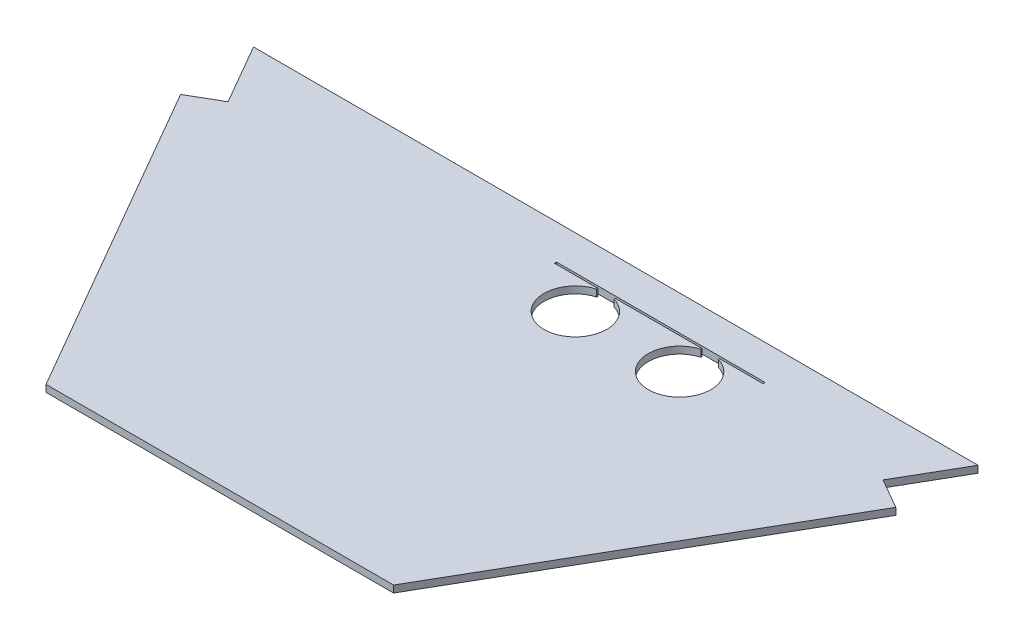
ISO-10303-21;
HEADER;
FILE_DESCRIPTION(('STEP AP214'),'2;1');
FILE_NAME('part.step','',(''),(''),'','','');
FILE_SCHEMA(('AUTOMOTIVE_DESIGN { 1 0 10303 214 1 1 1 1 }'));
ENDSEC;
DATA;
#1=APPLICATION_CONTEXT('core data for automotive mechanical design processes');
#2=APPLICATION_PROTOCOL_DEFINITION('international standard','automotive_design',2000,#1);
#3=PRODUCT_CONTEXT('',#1,'mechanical');
#4=PRODUCT('Part','Part','',(#3));
#5=PRODUCT_RELATED_PRODUCT_CATEGORY('part','',(#4));
#6=PRODUCT_DEFINITION_FORMATION('','',#4);
#7=PRODUCT_DEFINITION_CONTEXT('part definition',#1,'design');
#8=PRODUCT_DEFINITION('design','',#6,#7);
#9=PRODUCT_DEFINITION_SHAPE('','',#8);
#10=(LENGTH_UNIT() NAMED_UNIT(*) SI_UNIT(.MILLI.,.METRE.));
#11=(NAMED_UNIT(*) PLANE_ANGLE_UNIT() SI_UNIT($,.RADIAN.));
#12=(NAMED_UNIT(*) SI_UNIT($,.STERADIAN.) SOLID_ANGLE_UNIT());
#13=UNCERTAINTY_MEASURE_WITH_UNIT(LENGTH_MEASURE(1.E-05),#10,'distance_accuracy_value','');
#14=(GEOMETRIC_REPRESENTATION_CONTEXT(3) GLOBAL_UNCERTAINTY_ASSIGNED_CONTEXT((#13)) GLOBAL_UNIT_ASSIGNED_CONTEXT((#10,
#11,#12)) REPRESENTATION_CONTEXT('',''));
#15=CARTESIAN_POINT('',(0.,0.,0.));
#16=DIRECTION('',(0.,0.,1.));
#17=DIRECTION('',(1.,0.,0.));
#18=AXIS2_PLACEMENT_3D('',#15,#16,#17);
#19=CARTESIAN_POINT('',(0.,10.,0.));
#20=DIRECTION('',(0.86602540378444,0.,-0.499999999999998));
#21=DIRECTION('',(-0.499999999999998,0.,-0.86602540378444));
#22=AXIS2_PLACEMENT_3D('',#19,#20,#21);
#23=PLANE('',#22);
#24=DIRECTION('',(0.499999999999998,0.,0.86602540378444));
#25=VECTOR('',#24,1.);
#26=CARTESIAN_POINT('',(0.,0.,0.));
#27=LINE('',#26,#25);
#28=CARTESIAN_POINT('',(-264.434999999999,0.,-458.014855299477));
#29=VERTEX_POINT('',#28);
#30=CARTESIAN_POINT('',(0.,0.,0.));
#31=VERTEX_POINT('',#30);
#32=EDGE_CURVE('E250',#29,#31,#27,.T.);
#33=ORIENTED_EDGE('',*,*,#32,.T.);
#34=DIRECTION('',(0.,-1.,0.));
#35=VECTOR('',#34,1.);
#36=CARTESIAN_POINT('',(0.,10.,0.));
#37=LINE('',#36,#35);
#38=CARTESIAN_POINT('',(0.,10.,0.));
#39=VERTEX_POINT('',#38);
#40=EDGE_CURVE('E11',#39,#31,#37,.T.);
#41=ORIENTED_EDGE('',*,*,#40,.F.);
#42=DIRECTION('',(0.499999999999998,0.,0.86602540378444));
#43=VECTOR('',#42,1.);
#44=CARTESIAN_POINT('',(0.,10.,0.));
#45=LINE('',#44,#43);
#46=CARTESIAN_POINT('',(-264.434999999999,10.,-458.014855299477));
#47=VERTEX_POINT('',#46);
#48=EDGE_CURVE('E270',#47,#39,#45,.T.);
#49=ORIENTED_EDGE('',*,*,#48,.F.);
#50=DIRECTION('',(0.,-1.,0.));
#51=VECTOR('',#50,1.);
#52=CARTESIAN_POINT('',(-264.434999999999,10.,-458.014855299477));
#53=LINE('',#52,#51);
#54=EDGE_CURVE('E288',#47,#29,#53,.T.);
#55=ORIENTED_EDGE('',*,*,#54,.T.);
#56=EDGE_LOOP('',(#33,#41,#49,#55));
#57=FACE_BOUND('',#56,.T.);
#58=ADVANCED_FACE('F33',(#57),#23,.F.);
#59=CARTESIAN_POINT('',(500.,10.,0.));
#60=DIRECTION('',(0.,0.,-1.));
#61=DIRECTION('',(-1.,0.,0.));
#62=AXIS2_PLACEMENT_3D('',#59,#60,#61);
#63=PLANE('',#62);
#64=DIRECTION('',(1.,0.,0.));
#65=VECTOR('',#64,1.);
#66=CARTESIAN_POINT('',(500.,0.,0.));
#67=LINE('',#66,#65);
#68=CARTESIAN_POINT('',(500.,0.,0.));
#69=VERTEX_POINT('',#68);
#70=EDGE_CURVE('E291',#31,#69,#67,.T.);
#71=ORIENTED_EDGE('',*,*,#70,.T.);
#72=DIRECTION('',(0.,-1.,0.));
#73=VECTOR('',#72,1.);
#74=CARTESIAN_POINT('',(500.,10.,0.));
#75=LINE('',#74,#73);
#76=CARTESIAN_POINT('',(500.,10.,0.));
#77=VERTEX_POINT('',#76);
#78=EDGE_CURVE('E40',#77,#69,#75,.T.);
#79=ORIENTED_EDGE('',*,*,#78,.F.);
#80=DIRECTION('',(1.,0.,0.));
#81=VECTOR('',#80,1.);
#82=CARTESIAN_POINT('',(500.,10.,0.));
#83=LINE('',#82,#81);
#84=EDGE_CURVE('E273',#39,#77,#83,.T.);
#85=ORIENTED_EDGE('',*,*,#84,.F.);
#86=ORIENTED_EDGE('',*,*,#40,.T.);
#87=EDGE_LOOP('',(#71,#79,#85,#86));
#88=FACE_BOUND('',#87,.T.);
#89=ADVANCED_FACE('F346',(#88),#63,.F.);
#90=CARTESIAN_POINT('',(500.,10.,0.));
#91=DIRECTION('',(-0.866025403784437,0.,-0.500000000000004));
#92=DIRECTION('',(-0.500000000000004,0.,0.866025403784437));
#93=AXIS2_PLACEMENT_3D('',#90,#91,#92);
#94=PLANE('',#93);
#95=DIRECTION('',(0.500000000000004,0.,-0.866025403784436));
#96=VECTOR('',#95,1.);
#97=CARTESIAN_POINT('',(500.,0.,0.));
#98=LINE('',#97,#96);
#99=CARTESIAN_POINT('',(764.435000000002,0.,-458.014855299475));
#100=VERTEX_POINT('',#99);
#101=EDGE_CURVE('E293',#69,#100,#98,.T.);
#102=ORIENTED_EDGE('',*,*,#101,.T.);
#103=DIRECTION('',(0.,-1.,0.));
#104=VECTOR('',#103,1.);
#105=CARTESIAN_POINT('',(764.435000000002,10.,-458.014855299475));
#106=LINE('',#105,#104);
#107=CARTESIAN_POINT('',(764.435000000002,10.,-458.014855299475));
#108=VERTEX_POINT('',#107);
#109=EDGE_CURVE('E318',#108,#100,#106,.T.);
#110=ORIENTED_EDGE('',*,*,#109,.F.);
#111=DIRECTION('',(0.500000000000004,0.,-0.866025403784436));
#112=VECTOR('',#111,1.);
#113=CARTESIAN_POINT('',(500.,10.,0.));
#114=LINE('',#113,#112);
#115=EDGE_CURVE('E276',#77,#108,#114,.T.);
#116=ORIENTED_EDGE('',*,*,#115,.F.);
#117=ORIENTED_EDGE('',*,*,#78,.T.);
#118=EDGE_LOOP('',(#102,#110,#116,#117));
#119=FACE_BOUND('',#118,.T.);
#120=ADVANCED_FACE('F325',(#119),#94,.F.);
#121=CARTESIAN_POINT('',(764.435000000002,10.,-458.014855299475));
#122=DIRECTION('',(-0.500000000000006,0.,0.866025403784435));
#123=DIRECTION('',(0.866025403784435,0.,0.500000000000006));
#124=AXIS2_PLACEMENT_3D('',#121,#122,#123);
#125=PLANE('',#124);
#126=DIRECTION('',(-0.866025403784435,0.,-0.500000000000006));
#127=VECTOR('',#126,1.);
#128=CARTESIAN_POINT('',(764.435000000002,0.,-458.014855299475));
#129=LINE('',#128,#127);
#130=CARTESIAN_POINT('',(721.13372981078,0.,-483.014855299475));
#131=VERTEX_POINT('',#130);
#132=EDGE_CURVE('E295',#100,#131,#129,.T.);
#133=ORIENTED_EDGE('',*,*,#132,.T.);
#134=DIRECTION('',(0.,-1.,0.));
#135=VECTOR('',#134,1.);
#136=CARTESIAN_POINT('',(721.13372981078,10.,-483.014855299475));
#137=LINE('',#136,#135);
#138=CARTESIAN_POINT('',(721.13372981078,10.,-483.014855299475));
#139=VERTEX_POINT('',#138);
#140=EDGE_CURVE('E315',#139,#131,#137,.T.);
#141=ORIENTED_EDGE('',*,*,#140,.F.);
#142=DIRECTION('',(-0.866025403784435,0.,-0.500000000000006));
#143=VECTOR('',#142,1.);
#144=CARTESIAN_POINT('',(764.435000000002,10.,-458.014855299475));
#145=LINE('',#144,#143);
#146=EDGE_CURVE('E278',#108,#139,#145,.T.);
#147=ORIENTED_EDGE('',*,*,#146,.F.);
#148=ORIENTED_EDGE('',*,*,#109,.T.);
#149=EDGE_LOOP('',(#133,#141,#147,#148));
#150=FACE_BOUND('',#149,.T.);
#151=ADVANCED_FACE('F336',(#150),#125,.F.);
#152=CARTESIAN_POINT('',(721.13372981078,10.,-483.014855299475));
#153=DIRECTION('',(-0.866025403784437,0.,-0.500000000000003));
#154=DIRECTION('',(-0.500000000000003,0.,0.866025403784437));
#155=AXIS2_PLACEMENT_3D('',#152,#153,#154);
#156=PLANE('',#155);
#157=DIRECTION('',(0.500000000000003,0.,-0.866025403784437));
#158=VECTOR('',#157,1.);
#159=CARTESIAN_POINT('',(721.13372981078,0.,-483.014855299475));
#160=LINE('',#159,#158);
#161=CARTESIAN_POINT('',(771.13372981078,0.,-569.617395677919));
#162=VERTEX_POINT('',#161);
#163=EDGE_CURVE('E297',#131,#162,#160,.T.);
#164=ORIENTED_EDGE('',*,*,#163,.T.);
#165=DIRECTION('',(0.,-1.,0.));
#166=VECTOR('',#165,1.);
#167=CARTESIAN_POINT('',(771.13372981078,10.,-569.617395677919));
#168=LINE('',#167,#166);
#169=CARTESIAN_POINT('',(771.13372981078,10.,-569.617395677919));
#170=VERTEX_POINT('',#169);
#171=EDGE_CURVE('E312',#170,#162,#168,.T.);
#172=ORIENTED_EDGE('',*,*,#171,.F.);
#173=DIRECTION('',(0.500000000000003,0.,-0.866025403784437));
#174=VECTOR('',#173,1.);
#175=CARTESIAN_POINT('',(721.13372981078,10.,-483.014855299475));
#176=LINE('',#175,#174);
#177=EDGE_CURVE('E280',#139,#170,#176,.T.);
#178=ORIENTED_EDGE('',*,*,#177,.F.);
#179=ORIENTED_EDGE('',*,*,#140,.T.);
#180=EDGE_LOOP('',(#164,#172,#178,#179));
#181=FACE_BOUND('',#180,.T.);
#182=ADVANCED_FACE('F340',(#181),#156,.F.);
#183=CARTESIAN_POINT('',(-271.133729810777,10.,-569.617395677921));
#184=DIRECTION('',(0.,0.,1.));
#185=DIRECTION('',(1.,0.,0.));
#186=AXIS2_PLACEMENT_3D('',#183,#184,#185);
#187=PLANE('',#186);
#188=DIRECTION('',(-1.,0.,0.));
#189=VECTOR('',#188,1.);
#190=CARTESIAN_POINT('',(-271.133729810777,0.,-569.617395677921));
#191=LINE('',#190,#189);
#192=CARTESIAN_POINT('',(-271.133729810777,0.,-569.617395677921));
#193=VERTEX_POINT('',#192);
#194=EDGE_CURVE('E299',#162,#193,#191,.T.);
#195=ORIENTED_EDGE('',*,*,#194,.T.);
#196=DIRECTION('',(0.,-1.,0.));
#197=VECTOR('',#196,1.);
#198=CARTESIAN_POINT('',(-271.133729810777,10.,-569.617395677921));
#199=LINE('',#198,#197);
#200=CARTESIAN_POINT('',(-271.133729810777,10.,-569.617395677921));
#201=VERTEX_POINT('',#200);
#202=EDGE_CURVE('E309',#201,#193,#199,.T.);
#203=ORIENTED_EDGE('',*,*,#202,.F.);
#204=DIRECTION('',(-1.,0.,0.));
#205=VECTOR('',#204,1.);
#206=CARTESIAN_POINT('',(-271.133729810777,10.,-569.617395677921));
#207=LINE('',#206,#205);
#208=EDGE_CURVE('E282',#170,#201,#207,.T.);
#209=ORIENTED_EDGE('',*,*,#208,.F.);
#210=ORIENTED_EDGE('',*,*,#171,.T.);
#211=EDGE_LOOP('',(#195,#203,#209,#210));
#212=FACE_BOUND('',#211,.T.);
#213=ADVANCED_FACE('F359',(#212),#187,.F.);
#214=CARTESIAN_POINT('',(-221.133729810777,10.,-483.014855299476));
#215=DIRECTION('',(0.86602540378444,0.,-0.499999999999998));
#216=DIRECTION('',(-0.499999999999998,0.,-0.86602540378444));
#217=AXIS2_PLACEMENT_3D('',#214,#215,#216);
#218=PLANE('',#217);
#219=DIRECTION('',(0.499999999999998,0.,0.86602540378444));
#220=VECTOR('',#219,1.);
#221=CARTESIAN_POINT('',(-221.133729810777,0.,-483.014855299476));
#222=LINE('',#221,#220);
#223=CARTESIAN_POINT('',(-221.133729810777,0.,-483.014855299476));
#224=VERTEX_POINT('',#223);
#225=EDGE_CURVE('E301',#193,#224,#222,.T.);
#226=ORIENTED_EDGE('',*,*,#225,.T.);
#227=DIRECTION('',(0.,-1.,0.));
#228=VECTOR('',#227,1.);
#229=CARTESIAN_POINT('',(-221.133729810777,10.,-483.014855299476));
#230=LINE('',#229,#228);
#231=CARTESIAN_POINT('',(-221.133729810777,10.,-483.014855299476));
#232=VERTEX_POINT('',#231);
#233=EDGE_CURVE('E306',#232,#224,#230,.T.);
#234=ORIENTED_EDGE('',*,*,#233,.F.);
#235=DIRECTION('',(0.499999999999998,0.,0.86602540378444));
#236=VECTOR('',#235,1.);
#237=CARTESIAN_POINT('',(-221.133729810777,10.,-483.014855299476));
#238=LINE('',#237,#236);
#239=EDGE_CURVE('E284',#201,#232,#238,.T.);
#240=ORIENTED_EDGE('',*,*,#239,.F.);
#241=ORIENTED_EDGE('',*,*,#202,.T.);
#242=EDGE_LOOP('',(#226,#234,#240,#241));
#243=FACE_BOUND('',#242,.T.);
#244=ADVANCED_FACE('F357',(#243),#218,.F.);
#245=CARTESIAN_POINT('',(-264.434999999999,10.,-458.014855299477));
#246=DIRECTION('',(0.499999999999998,0.,0.86602540378444));
#247=DIRECTION('',(0.86602540378444,0.,-0.499999999999998));
#248=AXIS2_PLACEMENT_3D('',#245,#246,#247);
#249=PLANE('',#248);
#250=DIRECTION('',(-0.86602540378444,0.,0.499999999999998));
#251=VECTOR('',#250,1.);
#252=CARTESIAN_POINT('',(-264.434999999999,0.,-458.014855299477));
#253=LINE('',#252,#251);
#254=EDGE_CURVE('E274',#224,#29,#253,.T.);
#255=ORIENTED_EDGE('',*,*,#254,.T.);
#256=ORIENTED_EDGE('',*,*,#54,.F.);
#257=DIRECTION('',(-0.86602540378444,0.,0.499999999999998));
#258=VECTOR('',#257,1.);
#259=CARTESIAN_POINT('',(-264.434999999999,10.,-458.014855299477));
#260=LINE('',#259,#258);
#261=EDGE_CURVE('E286',#232,#47,#260,.T.);
#262=ORIENTED_EDGE('',*,*,#261,.F.);
#263=ORIENTED_EDGE('',*,*,#233,.T.);
#264=EDGE_LOOP('',(#255,#256,#262,#263));
#265=FACE_BOUND('',#264,.T.);
#266=ADVANCED_FACE('F352',(#265),#249,.F.);
#267=CARTESIAN_POINT('',(0.,10.,0.));
#268=DIRECTION('',(0.,-1.,0.));
#269=DIRECTION('',(0.,0.,-1.));
#270=AXIS2_PLACEMENT_3D('',#267,#268,#269);
#271=PLANE('',#270);
#272=DIRECTION('',(-1.,0.,0.));
#273=VECTOR('',#272,1.);
#274=CARTESIAN_POINT('',(514.88372981078,10.,-516.62));
#275=LINE('',#274,#273);
#276=CARTESIAN_POINT('',(514.88372981078,10.,-516.62));
#277=VERTEX_POINT('',#276);
#278=CARTESIAN_POINT('',(452.38,10.,-516.62));
#279=VERTEX_POINT('',#278);
#280=EDGE_CURVE('E177',#277,#279,#275,.T.);
#281=ORIENTED_EDGE('',*,*,#280,.T.);
#282=DIRECTION('',(0.,0.,1.));
#283=VECTOR('',#282,1.);
#284=CARTESIAN_POINT('',(452.38,10.,-516.62));
#285=LINE('',#284,#283);
#286=CARTESIAN_POINT('',(452.38,10.,-514.849041164477));
#287=VERTEX_POINT('',#286);
#288=EDGE_CURVE('E171',#279,#287,#285,.T.);
#289=ORIENTED_EDGE('',*,*,#288,.T.);
#290=CARTESIAN_POINT('',(439.88,10.,-471.62));
#291=DIRECTION('',(0.,-1.,0.));
#292=DIRECTION('',(0.,0.,-1.));
#293=AXIS2_PLACEMENT_3D('',#290,#291,#292);
#294=CIRCLE('',#293,45.0000000000002);
#295=CARTESIAN_POINT('',(427.38,10.,-514.849041164477));
#296=VERTEX_POINT('',#295);
#297=EDGE_CURVE('E180',#287,#296,#294,.T.);
#298=ORIENTED_EDGE('',*,*,#297,.T.);
#299=DIRECTION('',(0.,0.,-1.));
#300=VECTOR('',#299,1.);
#301=CARTESIAN_POINT('',(427.38,10.,-516.62));
#302=LINE('',#301,#300);
#303=CARTESIAN_POINT('',(427.38,10.,-516.62));
#304=VERTEX_POINT('',#303);
#305=EDGE_CURVE('E47',#296,#304,#302,.T.);
#306=ORIENTED_EDGE('',*,*,#305,.T.);
#307=DIRECTION('',(-1.,0.,0.));
#308=VECTOR('',#307,1.);
#309=CARTESIAN_POINT('',(427.38,10.,-516.62));
#310=LINE('',#309,#308);
#311=CARTESIAN_POINT('',(302.38,10.,-516.62));
#312=VERTEX_POINT('',#311);
#313=EDGE_CURVE('E195',#304,#312,#310,.T.);
#314=ORIENTED_EDGE('',*,*,#313,.T.);
#315=DIRECTION('',(0.,0.,1.));
#316=VECTOR('',#315,1.);
#317=CARTESIAN_POINT('',(302.38,10.,-516.62));
#318=LINE('',#317,#316);
#319=CARTESIAN_POINT('',(302.38,10.,-514.849041164476));
#320=VERTEX_POINT('',#319);
#321=EDGE_CURVE('E198',#312,#320,#318,.T.);
#322=ORIENTED_EDGE('',*,*,#321,.T.);
#323=CARTESIAN_POINT('',(289.88,10.,-471.62));
#324=DIRECTION('',(0.,-1.,0.));
#325=DIRECTION('',(0.,0.,-1.));
#326=AXIS2_PLACEMENT_3D('',#323,#324,#325);
#327=CIRCLE('',#326,45.);
#328=CARTESIAN_POINT('',(277.38,10.,-514.849041164476));
#329=VERTEX_POINT('',#328);
#330=EDGE_CURVE('E201',#320,#329,#327,.T.);
#331=ORIENTED_EDGE('',*,*,#330,.T.);
#332=DIRECTION('',(0.,0.,-1.));
#333=VECTOR('',#332,1.);
#334=CARTESIAN_POINT('',(277.38,10.,-514.849041164476));
#335=LINE('',#334,#333);
#336=CARTESIAN_POINT('',(277.38,10.,-516.62));
#337=VERTEX_POINT('',#336);
#338=EDGE_CURVE('E204',#329,#337,#335,.T.);
#339=ORIENTED_EDGE('',*,*,#338,.T.);
#340=DIRECTION('',(-1.,0.,0.));
#341=VECTOR('',#340,1.);
#342=CARTESIAN_POINT('',(277.38,10.,-516.62));
#343=LINE('',#342,#341);
#344=CARTESIAN_POINT('',(214.88372981078,10.,-516.62));
#345=VERTEX_POINT('',#344);
#346=EDGE_CURVE('E207',#337,#345,#343,.T.);
#347=ORIENTED_EDGE('',*,*,#346,.T.);
#348=DIRECTION('',(0.,0.,-1.));
#349=VECTOR('',#348,1.);
#350=CARTESIAN_POINT('',(214.88372981078,10.,-516.62));
#351=LINE('',#350,#349);
#352=CARTESIAN_POINT('',(214.88372981078,10.,-519.62));
#353=VERTEX_POINT('',#352);
#354=EDGE_CURVE('E210',#345,#353,#351,.T.);
#355=ORIENTED_EDGE('',*,*,#354,.T.);
#356=DIRECTION('',(1.,0.,0.));
#357=VECTOR('',#356,1.);
#358=CARTESIAN_POINT('',(214.88372981078,10.,-519.62));
#359=LINE('',#358,#357);
#360=CARTESIAN_POINT('',(514.88372981078,10.,-519.62));
#361=VERTEX_POINT('',#360);
#362=EDGE_CURVE('E213',#353,#361,#359,.T.);
#363=ORIENTED_EDGE('',*,*,#362,.T.);
#364=DIRECTION('',(0.,0.,1.));
#365=VECTOR('',#364,1.);
#366=CARTESIAN_POINT('',(514.88372981078,10.,-519.62));
#367=LINE('',#366,#365);
#368=EDGE_CURVE('E216',#361,#277,#367,.T.);
#369=ORIENTED_EDGE('',*,*,#368,.T.);
#370=EDGE_LOOP('',(#281,#289,#298,#306,#314,#322,#331,#339,#347,#355,#363,#369));
#371=FACE_BOUND('',#370,.T.);
#372=ORIENTED_EDGE('',*,*,#48,.T.);
#373=ORIENTED_EDGE('',*,*,#84,.T.);
#374=ORIENTED_EDGE('',*,*,#115,.T.);
#375=ORIENTED_EDGE('',*,*,#146,.T.);
#376=ORIENTED_EDGE('',*,*,#177,.T.);
#377=ORIENTED_EDGE('',*,*,#208,.T.);
#378=ORIENTED_EDGE('',*,*,#239,.T.);
#379=ORIENTED_EDGE('',*,*,#261,.T.);
#380=EDGE_LOOP('',(#372,#373,#374,#375,#376,#377,#378,#379));
#381=FACE_BOUND('',#380,.T.);
#382=ADVANCED_FACE('F184',(#371,#381),#271,.F.);
#383=CARTESIAN_POINT('',(0.,0.,0.));
#384=DIRECTION('',(0.,-1.,0.));
#385=DIRECTION('',(0.,0.,-1.));
#386=AXIS2_PLACEMENT_3D('',#383,#384,#385);
#387=PLANE('',#386);
#388=DIRECTION('',(0.,0.,1.));
#389=VECTOR('',#388,1.);
#390=CARTESIAN_POINT('',(452.38,0.,-516.62));
#391=LINE('',#390,#389);
#392=CARTESIAN_POINT('',(452.38,0.,-516.62));
#393=VERTEX_POINT('',#392);
#394=CARTESIAN_POINT('',(452.38,0.,-514.849041164477));
#395=VERTEX_POINT('',#394);
#396=EDGE_CURVE('E55',#393,#395,#391,.T.);
#397=ORIENTED_EDGE('',*,*,#396,.F.);
#398=DIRECTION('',(-1.,0.,0.));
#399=VECTOR('',#398,1.);
#400=CARTESIAN_POINT('',(514.88372981078,0.,-516.62));
#401=LINE('',#400,#399);
#402=CARTESIAN_POINT('',(514.88372981078,0.,-516.62));
#403=VERTEX_POINT('',#402);
#404=EDGE_CURVE('E188',#403,#393,#401,.T.);
#405=ORIENTED_EDGE('',*,*,#404,.F.);
#406=DIRECTION('',(0.,0.,1.));
#407=VECTOR('',#406,1.);
#408=CARTESIAN_POINT('',(514.88372981078,0.,-519.62));
#409=LINE('',#408,#407);
#410=CARTESIAN_POINT('',(514.88372981078,0.,-519.62));
#411=VERTEX_POINT('',#410);
#412=EDGE_CURVE('E191',#411,#403,#409,.T.);
#413=ORIENTED_EDGE('',*,*,#412,.F.);
#414=DIRECTION('',(1.,0.,0.));
#415=VECTOR('',#414,1.);
#416=CARTESIAN_POINT('',(214.88372981078,0.,-519.62));
#417=LINE('',#416,#415);
#418=CARTESIAN_POINT('',(214.88372981078,0.,-519.62));
#419=VERTEX_POINT('',#418);
#420=EDGE_CURVE('E243',#419,#411,#417,.T.);
#421=ORIENTED_EDGE('',*,*,#420,.F.);
#422=DIRECTION('',(0.,0.,-1.));
#423=VECTOR('',#422,1.);
#424=CARTESIAN_POINT('',(214.88372981078,0.,-516.62));
#425=LINE('',#424,#423);
#426=CARTESIAN_POINT('',(214.88372981078,0.,-516.62));
#427=VERTEX_POINT('',#426);
#428=EDGE_CURVE('E240',#427,#419,#425,.T.);
#429=ORIENTED_EDGE('',*,*,#428,.F.);
#430=DIRECTION('',(-1.,0.,0.));
#431=VECTOR('',#430,1.);
#432=CARTESIAN_POINT('',(277.38,0.,-516.62));
#433=LINE('',#432,#431);
#434=CARTESIAN_POINT('',(277.38,0.,-516.62));
#435=VERTEX_POINT('',#434);
#436=EDGE_CURVE('E237',#435,#427,#433,.T.);
#437=ORIENTED_EDGE('',*,*,#436,.F.);
#438=DIRECTION('',(0.,0.,-1.));
#439=VECTOR('',#438,1.);
#440=CARTESIAN_POINT('',(277.38,0.,-514.849041164476));
#441=LINE('',#440,#439);
#442=CARTESIAN_POINT('',(277.38,0.,-514.849041164476));
#443=VERTEX_POINT('',#442);
#444=EDGE_CURVE('E234',#443,#435,#441,.T.);
#445=ORIENTED_EDGE('',*,*,#444,.F.);
#446=CARTESIAN_POINT('',(289.88,0.,-471.62));
#447=DIRECTION('',(0.,-1.,0.));
#448=DIRECTION('',(0.,0.,-1.));
#449=AXIS2_PLACEMENT_3D('',#446,#447,#448);
#450=CIRCLE('',#449,45.);
#451=CARTESIAN_POINT('',(302.38,0.,-514.849041164476));
#452=VERTEX_POINT('',#451);
#453=EDGE_CURVE('E231',#452,#443,#450,.T.);
#454=ORIENTED_EDGE('',*,*,#453,.F.);
#455=DIRECTION('',(0.,0.,1.));
#456=VECTOR('',#455,1.);
#457=CARTESIAN_POINT('',(302.38,0.,-516.62));
#458=LINE('',#457,#456);
#459=CARTESIAN_POINT('',(302.38,0.,-516.62));
#460=VERTEX_POINT('',#459);
#461=EDGE_CURVE('E228',#460,#452,#458,.T.);
#462=ORIENTED_EDGE('',*,*,#461,.F.);
#463=DIRECTION('',(-1.,0.,0.));
#464=VECTOR('',#463,1.);
#465=CARTESIAN_POINT('',(427.38,0.,-516.62));
#466=LINE('',#465,#464);
#467=CARTESIAN_POINT('',(427.38,0.,-516.62));
#468=VERTEX_POINT('',#467);
#469=EDGE_CURVE('E225',#468,#460,#466,.T.);
#470=ORIENTED_EDGE('',*,*,#469,.F.);
#471=DIRECTION('',(0.,0.,-1.));
#472=VECTOR('',#471,1.);
#473=CARTESIAN_POINT('',(427.38,0.,-516.62));
#474=LINE('',#473,#472);
#475=CARTESIAN_POINT('',(427.38,0.,-514.849041164477));
#476=VERTEX_POINT('',#475);
#477=EDGE_CURVE('E222',#476,#468,#474,.T.);
#478=ORIENTED_EDGE('',*,*,#477,.F.);
#479=CARTESIAN_POINT('',(439.88,0.,-471.62));
#480=DIRECTION('',(0.,-1.,0.));
#481=DIRECTION('',(0.,0.,-1.));
#482=AXIS2_PLACEMENT_3D('',#479,#480,#481);
#483=CIRCLE('',#482,45.0000000000002);
#484=EDGE_CURVE('E220',#395,#476,#483,.T.);
#485=ORIENTED_EDGE('',*,*,#484,.F.);
#486=EDGE_LOOP('',(#397,#405,#413,#421,#429,#437,#445,#454,#462,#470,#478,#485));
#487=FACE_BOUND('',#486,.T.);
#488=ORIENTED_EDGE('',*,*,#32,.F.);
#489=ORIENTED_EDGE('',*,*,#254,.F.);
#490=ORIENTED_EDGE('',*,*,#225,.F.);
#491=ORIENTED_EDGE('',*,*,#194,.F.);
#492=ORIENTED_EDGE('',*,*,#163,.F.);
#493=ORIENTED_EDGE('',*,*,#132,.F.);
#494=ORIENTED_EDGE('',*,*,#101,.F.);
#495=ORIENTED_EDGE('',*,*,#70,.F.);
#496=EDGE_LOOP('',(#488,#489,#490,#491,#492,#493,#494,#495));
#497=FACE_BOUND('',#496,.T.);
#498=ADVANCED_FACE('F331',(#487,#497),#387,.T.);
#499=CARTESIAN_POINT('',(452.38,10.,-516.62));
#500=DIRECTION('',(1.,0.,0.));
#501=DIRECTION('',(0.,0.,-1.));
#502=AXIS2_PLACEMENT_3D('',#499,#500,#501);
#503=PLANE('',#502);
#504=ORIENTED_EDGE('',*,*,#396,.T.);
#505=DIRECTION('',(0.,-1.,0.));
#506=VECTOR('',#505,1.);
#507=CARTESIAN_POINT('',(452.38,10.,-514.849041164477));
#508=LINE('',#507,#506);
#509=EDGE_CURVE('E167',#287,#395,#508,.T.);
#510=ORIENTED_EDGE('',*,*,#509,.F.);
#511=ORIENTED_EDGE('',*,*,#288,.F.);
#512=DIRECTION('',(0.,-1.,0.));
#513=VECTOR('',#512,1.);
#514=CARTESIAN_POINT('',(452.38,10.,-516.62));
#515=LINE('',#514,#513);
#516=EDGE_CURVE('E248',#279,#393,#515,.T.);
#517=ORIENTED_EDGE('',*,*,#516,.T.);
#518=EDGE_LOOP('',(#504,#510,#511,#517));
#519=FACE_BOUND('',#518,.T.);
#520=ADVANCED_FACE('F169',(#519),#503,.F.);
#521=CARTESIAN_POINT('',(514.88372981078,10.,-516.62));
#522=DIRECTION('',(0.,0.,1.));
#523=DIRECTION('',(1.,0.,0.));
#524=AXIS2_PLACEMENT_3D('',#521,#522,#523);
#525=PLANE('',#524);
#526=ORIENTED_EDGE('',*,*,#404,.T.);
#527=ORIENTED_EDGE('',*,*,#516,.F.);
#528=ORIENTED_EDGE('',*,*,#280,.F.);
#529=DIRECTION('',(0.,-1.,0.));
#530=VECTOR('',#529,1.);
#531=CARTESIAN_POINT('',(514.88372981078,10.,-516.62));
#532=LINE('',#531,#530);
#533=EDGE_CURVE('E251',#277,#403,#532,.T.);
#534=ORIENTED_EDGE('',*,*,#533,.T.);
#535=EDGE_LOOP('',(#526,#527,#528,#534));
#536=FACE_BOUND('',#535,.T.);
#537=ADVANCED_FACE('F426',(#536),#525,.F.);
#538=CARTESIAN_POINT('',(514.88372981078,10.,-519.62));
#539=DIRECTION('',(1.,0.,0.));
#540=DIRECTION('',(0.,0.,-1.));
#541=AXIS2_PLACEMENT_3D('',#538,#539,#540);
#542=PLANE('',#541);
#543=ORIENTED_EDGE('',*,*,#412,.T.);
#544=ORIENTED_EDGE('',*,*,#533,.F.);
#545=ORIENTED_EDGE('',*,*,#368,.F.);
#546=DIRECTION('',(0.,-1.,0.));
#547=VECTOR('',#546,1.);
#548=CARTESIAN_POINT('',(514.88372981078,10.,-519.62));
#549=LINE('',#548,#547);
#550=EDGE_CURVE('E253',#361,#411,#549,.T.);
#551=ORIENTED_EDGE('',*,*,#550,.T.);
#552=EDGE_LOOP('',(#543,#544,#545,#551));
#553=FACE_BOUND('',#552,.T.);
#554=ADVANCED_FACE('F435',(#553),#542,.F.);
#555=CARTESIAN_POINT('',(214.88372981078,10.,-519.62));
#556=DIRECTION('',(0.,0.,-1.));
#557=DIRECTION('',(-1.,0.,0.));
#558=AXIS2_PLACEMENT_3D('',#555,#556,#557);
#559=PLANE('',#558);
#560=ORIENTED_EDGE('',*,*,#420,.T.);
#561=ORIENTED_EDGE('',*,*,#550,.F.);
#562=ORIENTED_EDGE('',*,*,#362,.F.);
#563=DIRECTION('',(0.,-1.,0.));
#564=VECTOR('',#563,1.);
#565=CARTESIAN_POINT('',(214.88372981078,10.,-519.62));
#566=LINE('',#565,#564);
#567=EDGE_CURVE('E255',#353,#419,#566,.T.);
#568=ORIENTED_EDGE('',*,*,#567,.T.);
#569=EDGE_LOOP('',(#560,#561,#562,#568));
#570=FACE_BOUND('',#569,.T.);
#571=ADVANCED_FACE('F445',(#570),#559,.F.);
#572=CARTESIAN_POINT('',(214.88372981078,10.,-516.62));
#573=DIRECTION('',(-1.,0.,0.));
#574=DIRECTION('',(0.,0.,1.));
#575=AXIS2_PLACEMENT_3D('',#572,#573,#574);
#576=PLANE('',#575);
#577=ORIENTED_EDGE('',*,*,#428,.T.);
#578=ORIENTED_EDGE('',*,*,#567,.F.);
#579=ORIENTED_EDGE('',*,*,#354,.F.);
#580=DIRECTION('',(0.,-1.,0.));
#581=VECTOR('',#580,1.);
#582=CARTESIAN_POINT('',(214.88372981078,10.,-516.62));
#583=LINE('',#582,#581);
#584=EDGE_CURVE('E257',#345,#427,#583,.T.);
#585=ORIENTED_EDGE('',*,*,#584,.T.);
#586=EDGE_LOOP('',(#577,#578,#579,#585));
#587=FACE_BOUND('',#586,.T.);
#588=ADVANCED_FACE('F455',(#587),#576,.F.);
#589=CARTESIAN_POINT('',(277.38,10.,-516.62));
#590=DIRECTION('',(0.,0.,1.));
#591=DIRECTION('',(1.,0.,0.));
#592=AXIS2_PLACEMENT_3D('',#589,#590,#591);
#593=PLANE('',#592);
#594=ORIENTED_EDGE('',*,*,#436,.T.);
#595=ORIENTED_EDGE('',*,*,#584,.F.);
#596=ORIENTED_EDGE('',*,*,#346,.F.);
#597=DIRECTION('',(0.,-1.,0.));
#598=VECTOR('',#597,1.);
#599=CARTESIAN_POINT('',(277.38,10.,-516.62));
#600=LINE('',#599,#598);
#601=EDGE_CURVE('E259',#337,#435,#600,.T.);
#602=ORIENTED_EDGE('',*,*,#601,.T.);
#603=EDGE_LOOP('',(#594,#595,#596,#602));
#604=FACE_BOUND('',#603,.T.);
#605=ADVANCED_FACE('F465',(#604),#593,.F.);
#606=CARTESIAN_POINT('',(277.38,10.,-514.849041164476));
#607=DIRECTION('',(-1.,0.,0.));
#608=DIRECTION('',(0.,0.,1.));
#609=AXIS2_PLACEMENT_3D('',#606,#607,#608);
#610=PLANE('',#609);
#611=ORIENTED_EDGE('',*,*,#444,.T.);
#612=ORIENTED_EDGE('',*,*,#601,.F.);
#613=ORIENTED_EDGE('',*,*,#338,.F.);
#614=DIRECTION('',(0.,-1.,0.));
#615=VECTOR('',#614,1.);
#616=CARTESIAN_POINT('',(277.38,10.,-514.849041164476));
#617=LINE('',#616,#615);
#618=EDGE_CURVE('E261',#329,#443,#617,.T.);
#619=ORIENTED_EDGE('',*,*,#618,.T.);
#620=EDGE_LOOP('',(#611,#612,#613,#619));
#621=FACE_BOUND('',#620,.T.);
#622=ADVANCED_FACE('F475',(#621),#610,.F.);
#623=CARTESIAN_POINT('',(289.88,10.,-471.62));
#624=DIRECTION('',(0.,-1.,0.));
#625=DIRECTION('',(0.,0.,-1.));
#626=AXIS2_PLACEMENT_3D('',#623,#624,#625);
#627=CYLINDRICAL_SURFACE('',#626,45.);
#628=ORIENTED_EDGE('',*,*,#453,.T.);
#629=ORIENTED_EDGE('',*,*,#618,.F.);
#630=ORIENTED_EDGE('',*,*,#330,.F.);
#631=DIRECTION('',(0.,-1.,0.));
#632=VECTOR('',#631,1.);
#633=CARTESIAN_POINT('',(302.38,10.,-514.849041164476));
#634=LINE('',#633,#632);
#635=EDGE_CURVE('E263',#320,#452,#634,.T.);
#636=ORIENTED_EDGE('',*,*,#635,.T.);
#637=EDGE_LOOP('',(#628,#629,#630,#636));
#638=FACE_BOUND('',#637,.T.);
#639=ADVANCED_FACE('F485',(#638),#627,.F.);
#640=CARTESIAN_POINT('',(302.38,10.,-516.62));
#641=DIRECTION('',(1.,0.,0.));
#642=DIRECTION('',(0.,0.,-1.));
#643=AXIS2_PLACEMENT_3D('',#640,#641,#642);
#644=PLANE('',#643);
#645=ORIENTED_EDGE('',*,*,#461,.T.);
#646=ORIENTED_EDGE('',*,*,#635,.F.);
#647=ORIENTED_EDGE('',*,*,#321,.F.);
#648=DIRECTION('',(0.,-1.,0.));
#649=VECTOR('',#648,1.);
#650=CARTESIAN_POINT('',(302.38,10.,-516.62));
#651=LINE('',#650,#649);
#652=EDGE_CURVE('E265',#312,#460,#651,.T.);
#653=ORIENTED_EDGE('',*,*,#652,.T.);
#654=EDGE_LOOP('',(#645,#646,#647,#653));
#655=FACE_BOUND('',#654,.T.);
#656=ADVANCED_FACE('F495',(#655),#644,.F.);
#657=CARTESIAN_POINT('',(427.38,10.,-516.62));
#658=DIRECTION('',(0.,0.,1.));
#659=DIRECTION('',(1.,0.,0.));
#660=AXIS2_PLACEMENT_3D('',#657,#658,#659);
#661=PLANE('',#660);
#662=ORIENTED_EDGE('',*,*,#469,.T.);
#663=ORIENTED_EDGE('',*,*,#652,.F.);
#664=ORIENTED_EDGE('',*,*,#313,.F.);
#665=DIRECTION('',(0.,-1.,0.));
#666=VECTOR('',#665,1.);
#667=CARTESIAN_POINT('',(427.38,10.,-516.62));
#668=LINE('',#667,#666);
#669=EDGE_CURVE('E267',#304,#468,#668,.T.);
#670=ORIENTED_EDGE('',*,*,#669,.T.);
#671=EDGE_LOOP('',(#662,#663,#664,#670));
#672=FACE_BOUND('',#671,.T.);
#673=ADVANCED_FACE('F505',(#672),#661,.F.);
#674=CARTESIAN_POINT('',(427.38,10.,-516.62));
#675=DIRECTION('',(-1.,0.,0.));
#676=DIRECTION('',(0.,0.,1.));
#677=AXIS2_PLACEMENT_3D('',#674,#675,#676);
#678=PLANE('',#677);
#679=ORIENTED_EDGE('',*,*,#477,.T.);
#680=ORIENTED_EDGE('',*,*,#669,.F.);
#681=ORIENTED_EDGE('',*,*,#305,.F.);
#682=DIRECTION('',(0.,-1.,0.));
#683=VECTOR('',#682,1.);
#684=CARTESIAN_POINT('',(427.38,10.,-514.849041164477));
#685=LINE('',#684,#683);
#686=EDGE_CURVE('E176',#296,#476,#685,.T.);
#687=ORIENTED_EDGE('',*,*,#686,.T.);
#688=EDGE_LOOP('',(#679,#680,#681,#687));
#689=FACE_BOUND('',#688,.T.);
#690=ADVANCED_FACE('F515',(#689),#678,.F.);
#691=CARTESIAN_POINT('',(439.88,10.,-471.62));
#692=DIRECTION('',(0.,-1.,0.));
#693=DIRECTION('',(0.,0.,-1.));
#694=AXIS2_PLACEMENT_3D('',#691,#692,#693);
#695=CYLINDRICAL_SURFACE('',#694,45.0000000000002);
#696=ORIENTED_EDGE('',*,*,#484,.T.);
#697=ORIENTED_EDGE('',*,*,#686,.F.);
#698=ORIENTED_EDGE('',*,*,#297,.F.);
#699=ORIENTED_EDGE('',*,*,#509,.T.);
#700=EDGE_LOOP('',(#696,#697,#698,#699));
#701=FACE_BOUND('',#700,.T.);
#702=ADVANCED_FACE('F181',(#701),#695,.F.);
#703=CLOSED_SHELL('',(#58,#89,#120,#151,#182,#213,#244,#266,#382,#498,#520,#537,#554,#571,#588,
#605,#622,#639,#656,#673,#690,#702));
#704=MANIFOLD_SOLID_BREP('B2',#703);
#705=ADVANCED_BREP_SHAPE_REPRESENTATION('',(#18,#704),#14);
#706=SHAPE_DEFINITION_REPRESENTATION(#9,#705);
ENDSEC;
END-ISO-10303-21;
